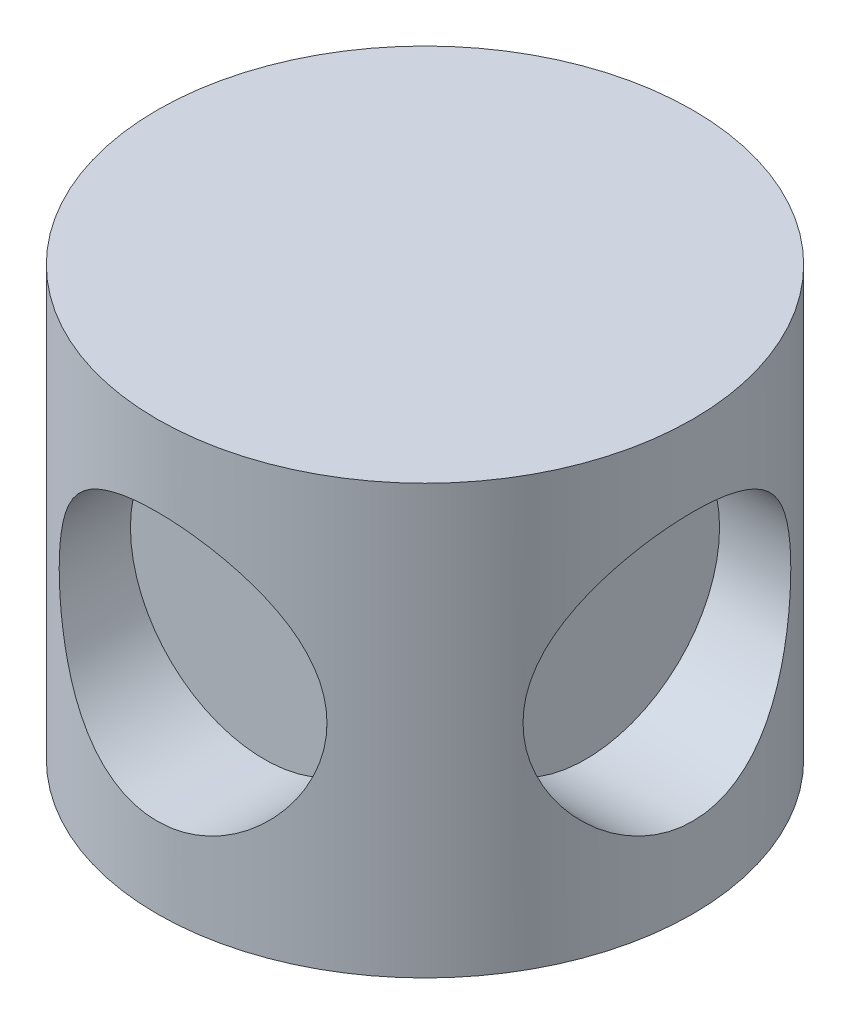
ISO-10303-21;
HEADER;
FILE_DESCRIPTION(('STEP AP214'),'2;1');
FILE_NAME('part.step','',(''),(''),'','','');
FILE_SCHEMA(('AUTOMOTIVE_DESIGN { 1 0 10303 214 1 1 1 1 }'));
ENDSEC;
DATA;
#1=APPLICATION_CONTEXT('core data for automotive mechanical design processes');
#2=APPLICATION_PROTOCOL_DEFINITION('international standard','automotive_design',2000,#1);
#3=PRODUCT_CONTEXT('',#1,'mechanical');
#4=PRODUCT('Part','Part','',(#3));
#5=PRODUCT_RELATED_PRODUCT_CATEGORY('part','',(#4));
#6=PRODUCT_DEFINITION_FORMATION('','',#4);
#7=PRODUCT_DEFINITION_CONTEXT('part definition',#1,'design');
#8=PRODUCT_DEFINITION('design','',#6,#7);
#9=PRODUCT_DEFINITION_SHAPE('','',#8);
#10=(LENGTH_UNIT() NAMED_UNIT(*) SI_UNIT(.MILLI.,.METRE.));
#11=(NAMED_UNIT(*) PLANE_ANGLE_UNIT() SI_UNIT($,.RADIAN.));
#12=(NAMED_UNIT(*) SI_UNIT($,.STERADIAN.) SOLID_ANGLE_UNIT());
#13=UNCERTAINTY_MEASURE_WITH_UNIT(LENGTH_MEASURE(1.E-05),#10,'distance_accuracy_value','');
#14=(GEOMETRIC_REPRESENTATION_CONTEXT(3) GLOBAL_UNCERTAINTY_ASSIGNED_CONTEXT((#13)) GLOBAL_UNIT_ASSIGNED_CONTEXT((#10,
#11,#12)) REPRESENTATION_CONTEXT('',''));
#15=CARTESIAN_POINT('',(0.,0.,0.));
#16=DIRECTION('',(0.,0.,1.));
#17=DIRECTION('',(1.,0.,0.));
#18=AXIS2_PLACEMENT_3D('',#15,#16,#17);
#19=CARTESIAN_POINT('',(0.,0.,0.));
#20=DIRECTION('',(0.,1.,0.));
#21=DIRECTION('',(1.,0.,0.));
#22=AXIS2_PLACEMENT_3D('',#19,#20,#21);
#23=PLANE('',#22);
#24=CARTESIAN_POINT('',(0.,0.,0.));
#25=DIRECTION('',(0.,1.,0.));
#26=DIRECTION('',(1.,0.,0.));
#27=AXIS2_PLACEMENT_3D('',#24,#25,#26);
#28=CIRCLE('',#27,25.);
#29=CARTESIAN_POINT('',(-25.,0.,0.));
#30=VERTEX_POINT('',#29);
#31=EDGE_CURVE('E11',#30,#30,#28,.T.);
#32=ORIENTED_EDGE('',*,*,#31,.F.);
#33=EDGE_LOOP('',(#32));
#34=FACE_BOUND('',#33,.T.);
#35=ADVANCED_FACE('F17',(#34),#23,.F.);
#36=CARTESIAN_POINT('',(0.,40.,0.));
#37=DIRECTION('',(0.,1.,0.));
#38=DIRECTION('',(1.,0.,0.));
#39=AXIS2_PLACEMENT_3D('',#36,#37,#38);
#40=PLANE('',#39);
#41=CARTESIAN_POINT('',(0.,40.,0.));
#42=DIRECTION('',(0.,1.,0.));
#43=DIRECTION('',(1.,0.,0.));
#44=AXIS2_PLACEMENT_3D('',#41,#42,#43);
#45=CIRCLE('',#44,25.);
#46=CARTESIAN_POINT('',(-25.,40.,0.));
#47=VERTEX_POINT('',#46);
#48=EDGE_CURVE('E154',#47,#47,#45,.T.);
#49=ORIENTED_EDGE('',*,*,#48,.T.);
#50=EDGE_LOOP('',(#49));
#51=FACE_BOUND('',#50,.T.);
#52=ADVANCED_FACE('F103',(#51),#40,.T.);
#53=CARTESIAN_POINT('',(0.,0.,0.));
#54=DIRECTION('',(0.,1.,0.));
#55=DIRECTION('',(1.,0.,0.));
#56=AXIS2_PLACEMENT_3D('',#53,#54,#55);
#57=CYLINDRICAL_SURFACE('',#56,25.);
#58=CARTESIAN_POINT('',(12.5,20.0000002980232,21.650635094611));
#59=CARTESIAN_POINT('',(12.500018135842,19.7941634114371,21.6506145983942));
#60=CARTESIAN_POINT('',(12.4950636390189,19.5883199571394,21.6534847200632));
#61=CARTESIAN_POINT('',(12.4751688470096,19.1780727046024,21.6649581039614));
#62=CARTESIAN_POINT('',(12.4602670826988,18.9736664149778,21.673539244102));
#63=CARTESIAN_POINT('',(12.4204522632843,18.56629227407,21.6963789581637));
#64=CARTESIAN_POINT('',(12.3955461716862,18.3633235219826,21.7106335829964));
#65=CARTESIAN_POINT('',(12.3357019327097,17.9588229972113,21.7446925260151));
#66=CARTESIAN_POINT('',(12.3007390122675,17.7572960481094,21.7645105456186));
#67=CARTESIAN_POINT('',(12.2207308989954,17.3556722325791,21.8095357825579));
#68=CARTESIAN_POINT('',(12.175630077806,17.1555897951343,21.8347726987142));
#69=CARTESIAN_POINT('',(12.0752737183179,16.7568453842748,21.890433593216));
#70=CARTESIAN_POINT('',(12.0199334846967,16.5582107892749,21.9209006687087));
#71=CARTESIAN_POINT('',(11.8990089329116,16.162346046928,21.9867774096253));
#72=CARTESIAN_POINT('',(11.8333134568001,15.9651587673665,22.0222402022005));
#73=CARTESIAN_POINT('',(11.6915458151399,15.5721821311492,22.0978345628983));
#74=CARTESIAN_POINT('',(11.6153388393775,15.376452969778,22.1380255814924));
#75=CARTESIAN_POINT('',(11.4567254146005,14.9965097880824,22.220512050571));
#76=CARTESIAN_POINT('',(11.3746387022303,14.8121344069793,22.2626805982932));
#77=CARTESIAN_POINT('',(11.2021835357267,14.4482726983621,22.3499532362464));
#78=CARTESIAN_POINT('',(11.1118245096841,14.2687811001867,22.395053968031));
#79=CARTESIAN_POINT('',(10.9227005390798,13.9146889601259,22.4879016597534));
#80=CARTESIAN_POINT('',(10.823925453225,13.7400946658733,22.5356517873329));
#81=CARTESIAN_POINT('',(10.6178610697291,13.3957820012593,22.6334725218002));
#82=CARTESIAN_POINT('',(10.5105427195975,13.2260831970154,22.6835507828393));
#83=CARTESIAN_POINT('',(10.2872742518179,12.8915488522234,22.7856784794626));
#84=CARTESIAN_POINT('',(10.1712772978273,12.7267475815469,22.8377377350944));
#85=CARTESIAN_POINT('',(9.93053395606293,12.4019927600524,22.9434503817893));
#86=CARTESIAN_POINT('',(9.80572451571197,12.2420890618391,22.9971132470547));
#87=CARTESIAN_POINT('',(9.54723522007463,11.927115486275,23.1056301794899));
#88=CARTESIAN_POINT('',(9.41347795917787,11.7721114383952,23.1604908124905));
#89=CARTESIAN_POINT('',(9.13698225598017,11.4669150091048,23.2709686618382));
#90=CARTESIAN_POINT('',(8.99415427837582,11.3168042105958,23.3265869559071));
#91=CARTESIAN_POINT('',(8.70336671995127,11.0254014957566,23.4366224538028));
#92=CARTESIAN_POINT('',(8.55550009430416,10.8840191448891,23.4910458110619));
#93=CARTESIAN_POINT('',(8.25414482572718,10.6095581430879,23.5986116470413));
#94=CARTESIAN_POINT('',(8.10071163773774,10.476421347153,23.651760940826));
#95=CARTESIAN_POINT('',(7.788211875518,10.2184351193943,23.7564884534943));
#96=CARTESIAN_POINT('',(7.62918601370587,10.0935395228658,23.8080743563464));
#97=CARTESIAN_POINT('',(7.30548900312479,9.85202464465862,23.9093803396799));
#98=CARTESIAN_POINT('',(7.14084412447755,9.73537305992055,23.9591072962009));
#99=CARTESIAN_POINT('',(6.80590828278562,9.51033179144994,24.0563912165931));
#100=CARTESIAN_POINT('',(6.63562983250495,9.40192535815982,24.1039524964493));
#101=CARTESIAN_POINT('',(6.28943569900762,9.19335709399748,24.1965928525015));
#102=CARTESIAN_POINT('',(6.11351991687652,9.09319540790044,24.2416718851055));
#103=CARTESIAN_POINT('',(5.75606657583401,8.90110476000775,24.3290283016791));
#104=CARTESIAN_POINT('',(5.57451784909935,8.80919377332377,24.3712995188089));
#105=CARTESIAN_POINT('',(5.20583725573573,8.63356652056724,24.4527103988141));
#106=CARTESIAN_POINT('',(5.01868507510609,8.54988644254406,24.4918361055924));
#107=CARTESIAN_POINT('',(4.63735331274341,8.39017231819768,24.5669136752085));
#108=CARTESIAN_POINT('',(4.44311222234686,8.31426065106212,24.6028138914018));
#109=CARTESIAN_POINT('',(4.05235599377836,8.17266578574837,24.6701708330144));
#110=CARTESIAN_POINT('',(3.8558810359589,8.1068907374202,24.701667186807));
#111=CARTESIAN_POINT('',(3.46077597121402,7.98553064809145,24.7601012053937));
#112=CARTESIAN_POINT('',(3.26217292135825,7.929873167763,24.7870711617542));
#113=CARTESIAN_POINT('',(2.86292310812157,7.82873365046777,24.8363426641476));
#114=CARTESIAN_POINT('',(2.66229215860376,7.78320063616839,24.8586675600341));
#115=CARTESIAN_POINT('',(2.25910419605803,7.70228639136937,24.8985415482035));
#116=CARTESIAN_POINT('',(2.05655403504844,7.66687746348814,24.9161036635364));
#117=CARTESIAN_POINT('',(1.64964740675696,7.60618782226979,24.9463478493774));
#118=CARTESIAN_POINT('',(1.4452915459359,7.58090383134457,24.9590314990625));
#119=CARTESIAN_POINT('',(1.03489558908469,7.54043969767827,24.9794173351121));
#120=CARTESIAN_POINT('',(0.828852836589912,7.52528114303294,24.9871088769922));
#121=CARTESIAN_POINT('',(0.415208668042124,7.50504111736364,24.9974118455455));
#122=CARTESIAN_POINT('',(0.207604425522768,7.500005806134,25.0000000008583));
#123=CARTESIAN_POINT('',(-0.207540230205063,7.49999479161566,24.9999999991419));
#124=CARTESIAN_POINT('',(-0.41508064330038,7.5050159781824,24.9974134424815));
#125=CARTESIAN_POINT('',(-0.828615505211449,7.52523326102926,24.9871163717049));
#126=CARTESIAN_POINT('',(-1.03461272569566,7.54038404587995,24.9794286770029));
#127=CARTESIAN_POINT('',(-1.44493608130325,7.5808345327097,24.9590518554121));
#128=CARTESIAN_POINT('',(-1.64926476192632,7.60611354436708,24.9463729257215));
#129=CARTESIAN_POINT('',(-2.05613551220862,7.66679602469471,24.9161381303442));
#130=CARTESIAN_POINT('',(-2.2586768071571,7.70220368072635,24.8985802476978));
#131=CARTESIAN_POINT('',(-2.66186545410424,7.78311798178526,24.8587133301977));
#132=CARTESIAN_POINT('',(-2.86250573131294,7.82865322485998,24.8363908485227));
#133=CARTESIAN_POINT('',(-3.26179259514121,7.92979965834677,24.7871214329862));
#134=CARTESIAN_POINT('',(-3.46042309783041,7.98546269560955,24.7601507430742));
#135=CARTESIAN_POINT('',(-3.85560094854158,8.10683722994473,24.7017112765958));
#136=CARTESIAN_POINT('',(-4.05212092963263,8.17262199207821,24.6702098227032));
#137=CARTESIAN_POINT('',(-4.44298610885484,8.314236463825,24.6028371738938));
#138=CARTESIAN_POINT('',(-4.63729080264923,8.39015875652303,24.5669259835413));
#139=CARTESIAN_POINT('',(-5.01862898148161,8.54985050979067,24.4918471482791));
#140=CARTESIAN_POINT('',(-5.20572673861749,8.63349207134536,24.452733482202));
#141=CARTESIAN_POINT('',(-5.57431407158153,8.80905462839678,24.3713458304015));
#142=CARTESIAN_POINT('',(-5.75582353902423,8.9009401771112,24.3290854964111));
#143=CARTESIAN_POINT('',(-6.1132151192559,9.09298905585722,24.2417485653896));
#144=CARTESIAN_POINT('',(-6.28910792096839,9.19313517967735,24.1966778676965));
#145=CARTESIAN_POINT('',(-6.63527231502299,9.40168225880889,24.1040508588554));
#146=CARTESIAN_POINT('',(-6.80554348444371,9.51008383316728,24.0564943613903));
#147=CARTESIAN_POINT('',(-7.14048080741628,9.73512515084107,23.9592156365365));
#148=CARTESIAN_POINT('',(-7.30513389243105,9.8517823876176,23.9094889014016));
#149=CARTESIAN_POINT('',(-7.62886321038431,10.0933182554235,23.8081779640366));
#150=CARTESIAN_POINT('',(-7.78791259610447,10.2182298978655,23.7565867305294));
#151=CARTESIAN_POINT('',(-8.10047445981612,10.476258561615,23.6518424550016));
#152=CARTESIAN_POINT('',(-8.25394563689608,10.6094224119869,23.5986816084748));
#153=CARTESIAN_POINT('',(-8.55539366779085,10.8839455363934,23.4910849446775));
#154=CARTESIAN_POINT('',(-8.7033144991793,11.0253635447688,23.4366422148941));
#155=CARTESIAN_POINT('',(-8.99411618909212,11.3167514766287,23.3266013685962));
#156=CARTESIAN_POINT('',(-9.13690843405231,11.4668076200957,23.2709973794367));
#157=CARTESIAN_POINT('',(-9.41334250630047,11.7719113977992,23.1605457039392));
#158=CARTESIAN_POINT('',(-9.54707328267182,11.9268779662688,23.1056969194408));
#159=CARTESIAN_POINT('',(-9.80552142170472,12.2417907897914,22.9971997375661));
#160=CARTESIAN_POINT('',(-9.93031552648848,12.4016717754551,22.9435448215065));
#161=CARTESIAN_POINT('',(-10.1710392717919,12.7263959994972,22.8378437149734));
#162=CARTESIAN_POINT('',(-10.2870312627163,12.891189938829,22.7857881520879));
#163=CARTESIAN_POINT('',(-10.5103008025351,13.2257243114027,22.6836629050383));
#164=CARTESIAN_POINT('',(-10.6176244517049,13.3954310138209,22.6335835556509));
#165=CARTESIAN_POINT('',(-10.8237103899792,13.7397741360811,22.535755163763));
#166=CARTESIAN_POINT('',(-10.922500976213,13.9143914989276,22.4879986681664));
#167=CARTESIAN_POINT('',(-11.1116661015941,14.2685448136796,22.3951326975843));
#168=CARTESIAN_POINT('',(-11.202050024577,14.4480749847091,22.3500202924929));
#169=CARTESIAN_POINT('',(-11.3745673777759,14.8120276119999,22.2627172012821));
#170=CARTESIAN_POINT('',(-11.456690640272,14.9964557525922,22.2205301352062));
#171=CARTESIAN_POINT('',(-11.6153380587585,15.3764207638044,22.1380259870959));
#172=CARTESIAN_POINT('',(-11.6915464909404,15.5721169984185,22.0978341948932));
#173=CARTESIAN_POINT('',(-11.8333153150914,15.965037906971,22.0222392188515));
#174=CARTESIAN_POINT('',(-11.8990102405927,16.16220249829,21.98677670094));
#175=CARTESIAN_POINT('',(-12.0199345363702,16.5580306638422,21.9209000921176));
#176=CARTESIAN_POINT('',(-12.0752747093752,16.7566515040236,21.8904330421928));
#177=CARTESIAN_POINT('',(-12.1756311745284,17.1553775480721,21.8347720917755));
#178=CARTESIAN_POINT('',(-12.2207317732679,17.3554554977769,21.8095352910553));
#179=CARTESIAN_POINT('',(-12.300739881469,17.7570793975181,21.7645100559694));
#180=CARTESIAN_POINT('',(-12.3357025968634,17.9586110283072,21.7446921479971));
#181=CARTESIAN_POINT('',(-12.3955468474839,18.3631300221098,21.7106331984125));
#182=CARTESIAN_POINT('',(-12.4204527120574,18.5661126481998,21.6963787007316));
#183=CARTESIAN_POINT('',(-12.4602675326428,18.9735236471884,21.6735389859864));
#184=CARTESIAN_POINT('',(-12.4751690722173,19.1779529793669,21.6649579748802));
#185=CARTESIAN_POINT('',(-12.4950638579671,19.588255514465,21.6534845929953));
#186=CARTESIAN_POINT('',(-12.5000181256449,19.7941312374401,21.650614601301));
#187=CARTESIAN_POINT('',(-12.5,20.0000002980232,21.6506350946109));
#188=B_SPLINE_CURVE_WITH_KNOTS('',3,(#58,#59,#60,#61,#62,#63,#64,#65,#66,#67,#68,#69,#70,#71,
#72,#73,#74,#75,#76,#77,#78,#79,#80,#81,#82,#83,#84,#85,#86,#87,#88,#89,#90,#91,#92,#93,#94,#95,
#96,#97,#98,#99,#100,#101,#102,#103,#104,#105,#106,#107,#108,#109,#110,#111,#112,#113,#114,#115,
#116,#117,#118,#119,#120,#121,#122,#123,#124,#125,#126,#127,#128,#129,#130,#131,#132,#133,#134,
#135,#136,#137,#138,#139,#140,#141,#142,#143,#144,#145,#146,#147,#148,#149,#150,#151,#152,#153,
#154,#155,#156,#157,#158,#159,#160,#161,#162,#163,#164,#165,#166,#167,#168,#169,#170,#171,#172,
#173,#174,#175,#176,#177,#178,#179,#180,#181,#182,#183,#184,#185,#186,#187),.UNSPECIFIED.,.F.,
.F.,(4,2,2,2,2,2,2,2,2,2,2,2,2,2,2,2,2,2,2,2,2,2,2,2,2,2,2,2,2,2,2,2,2,2,2,2,2,2,2,2,2,2,2,2,2,
2,2,2,2,2,2,2,2,2,2,2,2,2,2,2,2,2,2,2,4),(0.,0.617439472749179,1.23250105736169,
1.84713526855379,2.46329667244175,3.0829253722511,3.70792916870456,4.34016718802258,
4.98143561947662,5.59973973183031,6.21734772330359,6.83571074808509,7.45627464907138,
8.08046995986197,8.70970243030188,9.34534437374992,9.98872707269549,10.6235931643763,
11.2532998186243,11.8791116990426,12.5023171767621,13.1242208179436,13.7461353772299,
14.3693735361611,14.9952396438397,15.6298009922935,16.2582232877259,16.8819519320184,
17.5024651274796,18.1212641201534,18.7398626364246,19.3597758711453,19.982509422452,
20.6050504124581,21.2248251369257,21.8433401656917,22.4621112700197,23.0826523447802,
23.7064643987676,24.3350250079417,24.9697785882606,25.5954451092598,26.218539762181,
26.8403678285406,27.4622425695831,28.0854769555679,28.7113754042241,29.3412257855188,
29.9762919308139,30.6194773197834,31.2549774636934,31.8841245046094,32.508291282796,
33.1288837086128,33.7473320863755,34.3650816289378,34.983582462448,35.624762355581,
36.2569357588654,36.8819000511053,37.5015153725267,38.1176903266972,38.7323655802591,
39.3474960051134,39.9650321577721),.UNSPECIFIED.);
#189=CARTESIAN_POINT('',(12.5,20.0000002980232,21.650635094611));
#190=VERTEX_POINT('',#189);
#191=CARTESIAN_POINT('',(-12.5,20.0000002980232,21.650635094611));
#192=VERTEX_POINT('',#191);
#193=EDGE_CURVE('E166',#190,#192,#188,.T.);
#194=ORIENTED_EDGE('',*,*,#193,.T.);
#195=CARTESIAN_POINT('',(-12.5,20.0000002980232,21.6506350946109));
#196=CARTESIAN_POINT('',(-12.500018135842,20.2058371846003,21.6506145983942));
#197=CARTESIAN_POINT('',(-12.4950636390189,20.411680638889,21.6534847200632));
#198=CARTESIAN_POINT('',(-12.4751688470095,20.8219278914106,21.6649581039614));
#199=CARTESIAN_POINT('',(-12.4602670826987,21.0263341810288,21.6735392441021));
#200=CARTESIAN_POINT('',(-12.4204522632842,21.4337083219264,21.6963789581638));
#201=CARTESIAN_POINT('',(-12.395546171686,21.6366770740099,21.7106335829965));
#202=CARTESIAN_POINT('',(-12.3357019327095,22.041177598776,21.7446925260152));
#203=CARTESIAN_POINT('',(-12.3007390122673,22.2427045478767,21.7645105456188));
#204=CARTESIAN_POINT('',(-12.2207308989952,22.6443283634069,21.809535782558));
#205=CARTESIAN_POINT('',(-12.1756300778057,22.8444108008529,21.8347726987144));
#206=CARTESIAN_POINT('',(-12.0752737183177,23.2431552117176,21.8904335932162));
#207=CARTESIAN_POINT('',(-12.0199334846964,23.4417898067213,21.9209006687089));
#208=CARTESIAN_POINT('',(-11.8990089329112,23.8376545490785,21.9867774096255));
#209=CARTESIAN_POINT('',(-11.8333134567996,24.0348418286463,22.0222402022007));
#210=CARTESIAN_POINT('',(-11.6915458151397,24.4278184648792,22.0978345628984));
#211=CARTESIAN_POINT('',(-11.6153388393777,24.6235476262595,22.1380255814923));
#212=CARTESIAN_POINT('',(-11.4567254146086,25.003490807953,22.2205120505668));
#213=CARTESIAN_POINT('',(-11.3746387022469,25.1878661890452,22.2626805982846));
#214=CARTESIAN_POINT('',(-11.2021835357578,25.5517278976437,22.3499532362307));
#215=CARTESIAN_POINT('',(-11.111824509721,25.7312194958112,22.3950539680126));
#216=CARTESIAN_POINT('',(-10.9227005391263,26.0853116358593,22.4879016597308));
#217=CARTESIAN_POINT('',(-10.8239254532751,26.2599059301071,22.5356517873088));
#218=CARTESIAN_POINT('',(-10.6178610697842,26.6042185947149,22.6334725217744));
#219=CARTESIAN_POINT('',(-10.5105427196538,26.7739173989571,22.6835507828131));
#220=CARTESIAN_POINT('',(-10.2872742518745,27.1084517437491,22.785678479437));
#221=CARTESIAN_POINT('',(-10.1712772978827,27.2732530144271,22.8377377350698));
#222=CARTESIAN_POINT('',(-9.93053395611378,27.5980078359279,22.9434503817673));
#223=CARTESIAN_POINT('',(-9.80572451575925,27.7579115341459,22.9971132470346));
#224=CARTESIAN_POINT('',(-9.54723522011233,28.0728851097226,23.1056301794743));
#225=CARTESIAN_POINT('',(-9.41347795920943,28.2278891576101,23.1604908124778));
#226=CARTESIAN_POINT('',(-9.1369822559973,28.5330855869196,23.2709686618315));
#227=CARTESIAN_POINT('',(-8.99415427838455,28.6831963854398,23.3265869559038));
#228=CARTESIAN_POINT('',(-8.70336671996043,28.9745991002825,23.4366224537993));
#229=CARTESIAN_POINT('',(-8.55550009432302,29.1159814511431,23.491045811055));
#230=CARTESIAN_POINT('',(-8.25414482576265,29.3904424529324,23.5986116470288));
#231=CARTESIAN_POINT('',(-8.10071163778,29.523579248862,23.6517609408115));
#232=CARTESIAN_POINT('',(-7.78821187557137,29.7815654766125,23.7564884534768));
#233=CARTESIAN_POINT('',(-7.62918601376344,29.9064610731379,23.808074356328));
#234=CARTESIAN_POINT('',(-7.30548900318816,30.147975951341,23.9093803396605));
#235=CARTESIAN_POINT('',(-7.14084412454241,30.264627536078,23.9591072961816));
#236=CARTESIAN_POINT('',(-6.80590828285077,30.4896688045486,24.0563912165747));
#237=CARTESIAN_POINT('',(-6.63562983256878,30.5980752378397,24.1039524964318));
#238=CARTESIAN_POINT('',(-6.28943569906616,30.8066435020061,24.1965928524864));
#239=CARTESIAN_POINT('',(-6.11351991693096,30.9068051881061,24.2416718850918));
#240=CARTESIAN_POINT('',(-5.75606657587742,31.0988958360069,24.3290283016689));
#241=CARTESIAN_POINT('',(-5.57451784913574,31.1908068226958,24.3712995188006));
#242=CARTESIAN_POINT('',(-5.20583725575543,31.3664340754648,24.45271039881));
#243=CARTESIAN_POINT('',(-5.01868507511605,31.4501141534953,24.4918361055905));
#244=CARTESIAN_POINT('',(-4.63735331274703,31.6098282778502,24.5669136752077));
#245=CARTESIAN_POINT('',(-4.4431122223542,31.6857399449876,24.6028138914004));
#246=CARTESIAN_POINT('',(-4.05235599379198,31.8273348103042,24.6701708330122));
#247=CARTESIAN_POINT('',(-3.85588103597508,31.8931098586333,24.7016671868044));
#248=CARTESIAN_POINT('',(-3.46077597123435,32.0144699479638,24.7601012053909));
#249=CARTESIAN_POINT('',(-3.26217292138016,32.0701274282929,24.7870711617513));
#250=CARTESIAN_POINT('',(-2.86292310814559,32.171266945589,24.8363426641448));
#251=CARTESIAN_POINT('',(-2.66229215862829,32.2167999598886,24.8586675600315));
#252=CARTESIAN_POINT('',(-2.25910419608259,32.2977142046876,24.8985415482012));
#253=CARTESIAN_POINT('',(-2.05655403507248,32.3331231325686,24.9161036635345));
#254=CARTESIAN_POINT('',(-1.64964740677892,32.393812773786,24.946347849376));
#255=CARTESIAN_POINT('',(-1.44529154595629,32.4190967647106,24.9590314990613));
#256=CARTESIAN_POINT('',(-1.03489558910088,32.4595608983752,24.9794173351115));
#257=CARTESIAN_POINT('',(-0.828852836603487,32.4747194530194,24.9871088769917));
#258=CARTESIAN_POINT('',(-0.415208668049415,32.494959478686,24.9974118455454));
#259=CARTESIAN_POINT('',(-0.207604425526396,32.4999947899141,25.0000000008583));
#260=CARTESIAN_POINT('',(0.20754023020703,32.5000058044291,24.9999999991419));
#261=CARTESIAN_POINT('',(0.415080643304277,32.4949846178608,24.9974134424814));
#262=CARTESIAN_POINT('',(0.828615505218643,32.4747673350113,24.9871163717047));
#263=CARTESIAN_POINT('',(1.03461272570422,32.4596165501596,24.9794286770025));
#264=CARTESIAN_POINT('',(1.44493608131399,32.4191660633281,24.9590518554115));
#265=CARTESIAN_POINT('',(1.64926476193787,32.3938870516701,24.9463729257208));
#266=CARTESIAN_POINT('',(2.05613551222125,32.3332045713416,24.9161381303432));
#267=CARTESIAN_POINT('',(2.25867680717,32.2977969153098,24.8985802476966));
#268=CARTESIAN_POINT('',(2.66186545411712,32.2168826142508,24.8587133301963));
#269=CARTESIAN_POINT('',(2.86250573132552,32.1713473711763,24.8363908485212));
#270=CARTESIAN_POINT('',(3.26179259515267,32.0702009376904,24.7871214329847));
#271=CARTESIAN_POINT('',(3.46042309784106,32.0145379004283,24.7601507430727));
#272=CARTESIAN_POINT('',(3.85560094855002,31.8931633660949,24.7017112765945));
#273=CARTESIAN_POINT('',(4.05212092963967,31.8273786039625,24.670209822702));
#274=CARTESIAN_POINT('',(4.4429861088586,31.6857641322184,24.6028371738931));
#275=CARTESIAN_POINT('',(4.63729080265113,31.6098418395219,24.5669259835409));
#276=CARTESIAN_POINT('',(5.01862898147737,31.4501500862583,24.4918471482799));
#277=CARTESIAN_POINT('',(5.20572673860904,31.3665085247061,24.4527334822038));
#278=CARTESIAN_POINT('',(5.57431407156595,31.190945967659,24.371345830405));
#279=CARTESIAN_POINT('',(5.75582353900568,31.0990604189464,24.3290854964154));
#280=CARTESIAN_POINT('',(6.11321511923265,30.9070115402032,24.2417485653955));
#281=CARTESIAN_POINT('',(6.28910792094337,30.8068654163841,24.1966778677029));
#282=CARTESIAN_POINT('',(6.6352723149957,30.598318337254,24.1040508588629));
#283=CARTESIAN_POINT('',(6.80554348441587,30.4899167628959,24.0564943613981));
#284=CARTESIAN_POINT('',(7.14048080738857,30.2648754452221,23.9592156365447));
#285=CARTESIAN_POINT('',(7.30513389240397,30.1482182084452,23.9094889014099));
#286=CARTESIAN_POINT('',(7.62886321035971,29.9066823406379,23.8081779640445));
#287=CARTESIAN_POINT('',(7.78791259608167,29.7817706981948,23.7565867305368));
#288=CARTESIAN_POINT('',(8.10047445979808,29.5237420344424,23.6518424550078));
#289=CARTESIAN_POINT('',(8.25394563688095,29.3905781840688,23.5986816084801));
#290=CARTESIAN_POINT('',(8.55539366778277,29.1160550596579,23.4910849446804));
#291=CARTESIAN_POINT('',(8.70331449917532,28.9746370512801,23.4366422148956));
#292=CARTESIAN_POINT('',(8.99411618909756,28.6832491194141,23.3266013685941));
#293=CARTESIAN_POINT('',(9.13690843406301,28.5331929759435,23.2709973794326));
#294=CARTESIAN_POINT('',(9.41334250632007,28.2280891982337,23.1605457039313));
#295=CARTESIAN_POINT('',(9.54707328269511,28.0731226297615,23.1056969194312));
#296=CARTESIAN_POINT('',(9.80552142173381,27.7582098062345,22.9971997375537));
#297=CARTESIAN_POINT('',(9.93031552651977,27.5983288205693,22.9435448214929));
#298=CARTESIAN_POINT('',(10.171039271826,27.2736045965251,22.8378437149582));
#299=CARTESIAN_POINT('',(10.2870312627511,27.1088106571928,22.7857881520722));
#300=CARTESIAN_POINT('',(10.5103008025697,26.7742762846191,22.6836629050223));
#301=CARTESIAN_POINT('',(10.6176244517388,26.6045695822015,22.633583555635));
#302=CARTESIAN_POINT('',(10.82371039001,26.2602264599433,22.5357551637481));
#303=CARTESIAN_POINT('',(10.9225009762416,26.0856090970984,22.4879986681525));
#304=CARTESIAN_POINT('',(11.1116661016169,25.7314557823507,22.395132697573));
#305=CARTESIAN_POINT('',(11.2020500245962,25.5519256113239,22.3500202924832));
#306=CARTESIAN_POINT('',(11.3745673777863,25.1879729840393,22.2627172012767));
#307=CARTESIAN_POINT('',(11.4566906402771,25.0035448434506,22.2205301352035));
#308=CARTESIAN_POINT('',(11.6153380587586,24.6235798322334,22.1380259870959));
#309=CARTESIAN_POINT('',(11.6915464909403,24.4278835976105,22.0978341948933));
#310=CARTESIAN_POINT('',(11.8333153150911,24.0349626890432,22.0222392188517));
#311=CARTESIAN_POINT('',(11.8990102405924,23.8377980977181,21.9867767009401));
#312=CARTESIAN_POINT('',(12.01993453637,23.4419699321561,21.9209000921177));
#313=CARTESIAN_POINT('',(12.075274709375,23.2433490919711,21.8904330421929));
#314=CARTESIAN_POINT('',(12.1756311745282,22.8446230479177,21.8347720917757));
#315=CARTESIAN_POINT('',(12.2207317732677,22.6445450982117,21.8095352910554));
#316=CARTESIAN_POINT('',(12.3007398814687,22.2429211984704,21.7645100559695));
#317=CARTESIAN_POINT('',(12.3357025968632,22.0413895676826,21.7446921479972));
#318=CARTESIAN_POINT('',(12.3955468474837,21.636870573885,21.7106331984126));
#319=CARTESIAN_POINT('',(12.4204527120573,21.4338879477986,21.6963787007317));
#320=CARTESIAN_POINT('',(12.4602675326426,21.0264769488199,21.6735389859865));
#321=CARTESIAN_POINT('',(12.4751690722172,20.8220476166475,21.6649579748802));
#322=CARTESIAN_POINT('',(12.4950638579671,20.4117450815641,21.6534845929953));
#323=CARTESIAN_POINT('',(12.5000181256449,20.2058693585977,21.650614601301));
#324=CARTESIAN_POINT('',(12.5,20.0000002980232,21.650635094611));
#325=B_SPLINE_CURVE_WITH_KNOTS('',3,(#195,#196,#197,#198,#199,#200,#201,#202,#203,#204,#205,
#206,#207,#208,#209,#210,#211,#212,#213,#214,#215,#216,#217,#218,#219,#220,#221,#222,#223,#224,
#225,#226,#227,#228,#229,#230,#231,#232,#233,#234,#235,#236,#237,#238,#239,#240,#241,#242,#243,
#244,#245,#246,#247,#248,#249,#250,#251,#252,#253,#254,#255,#256,#257,#258,#259,#260,#261,#262,
#263,#264,#265,#266,#267,#268,#269,#270,#271,#272,#273,#274,#275,#276,#277,#278,#279,#280,#281,
#282,#283,#284,#285,#286,#287,#288,#289,#290,#291,#292,#293,#294,#295,#296,#297,#298,#299,#300,
#301,#302,#303,#304,#305,#306,#307,#308,#309,#310,#311,#312,#313,#314,#315,#316,#317,#318,#319,
#320,#321,#322,#323,#324),.UNSPECIFIED.,.F.,.F.,(4,2,2,2,2,2,2,2,2,2,2,2,2,2,2,2,2,2,2,2,2,2,2,
2,2,2,2,2,2,2,2,2,2,2,2,2,2,2,2,2,2,2,2,2,2,2,2,2,2,2,2,2,2,2,2,2,2,2,2,2,2,2,2,2,4),(0.,
0.617439472722228,1.23250105731556,1.84713526849623,2.46329667238043,3.08292537219353,
3.70792916865803,4.34016718799409,4.98143561947285,5.59973973178452,6.21734772322748,
6.83571074799065,7.45627464897078,8.08046995976755,8.70970243022596,9.34534437370479,
9.98872707269336,10.6235931643374,11.2532998185589,11.8791116989614,12.5023171766754,
13.1242208178623,13.7461353771644,14.3693735361217,14.9952396438366,15.6298009922818,
16.2582232877077,16.8819519319962,17.502465127456,18.1212641201312,18.7398626364069,
19.3597758711352,19.9825094224527,20.6050504124648,21.2248251369367,21.8433401657054,
22.4621112700343,23.0826523447939,23.7064643987785,24.3350250079475,24.9697785882594,
25.5954451092438,26.2185397621543,26.8403678285074,27.4622425695479,28.0854769555348,
28.7113754041974,29.3412257855026,29.9762919308124,30.6194773198018,31.2549774637257,
31.88412450465,32.5082912828394,33.1288837086535,33.7473320864083,34.3650816289578,
34.9835824624505,35.6247623556072,36.2569357589088,36.8819000511593,37.5015153725842,
38.1176903267512,38.732365580302,39.347496005138,39.9650321577709),.UNSPECIFIED.);
#326=EDGE_CURVE('E161',#192,#190,#325,.T.);
#327=ORIENTED_EDGE('',*,*,#326,.T.);
#328=EDGE_LOOP('',(#194,#327));
#329=FACE_BOUND('',#328,.T.);
#330=CARTESIAN_POINT('',(21.650635094611,20.,-12.5));
#331=CARTESIAN_POINT('',(21.6506145983942,19.7941631134142,-12.500018135842));
#332=CARTESIAN_POINT('',(21.6534847200632,19.5883196591167,-12.4950636390189));
#333=CARTESIAN_POINT('',(21.6649581039614,19.1780724065802,-12.4751688470095));
#334=CARTESIAN_POINT('',(21.6735392441021,18.9736661169557,-12.4602670826988));
#335=CARTESIAN_POINT('',(21.6963789581637,18.5662919760482,-12.4204522632843));
#336=CARTESIAN_POINT('',(21.7106335829964,18.3633232239609,-12.3955461716861));
#337=CARTESIAN_POINT('',(21.7446925260151,17.9588226991898,-12.3357019327097));
#338=CARTESIAN_POINT('',(21.7645105456187,17.7572957500879,-12.3007390122674));
#339=CARTESIAN_POINT('',(21.8095357825579,17.3556719345576,-12.2207308989954));
#340=CARTESIAN_POINT('',(21.8347726987142,17.1555894971128,-12.1756300778059));
#341=CARTESIAN_POINT('',(21.8904335932161,16.7568450862531,-12.0752737183179));
#342=CARTESIAN_POINT('',(21.9209006687087,16.5582104912532,-12.0199334846967));
#343=CARTESIAN_POINT('',(21.9867774096253,16.1623457489059,-11.8990089329115));
#344=CARTESIAN_POINT('',(22.0222402022005,15.9651584693442,-11.8333134568));
#345=CARTESIAN_POINT('',(22.0978345628983,15.5721818331264,-11.6915458151399));
#346=CARTESIAN_POINT('',(22.1380255814923,15.376452671755,-11.6153388393776));
#347=CARTESIAN_POINT('',(22.2205120505695,14.9965094900662,-11.4567254146034));
#348=CARTESIAN_POINT('',(22.2626805982901,14.8121341089702,-11.3746387022363));
#349=CARTESIAN_POINT('',(22.3499532362407,14.4482724003651,-11.202183535738));
#350=CARTESIAN_POINT('',(22.3950539680242,14.2687808021947,-11.1118245096976));
#351=CARTESIAN_POINT('',(22.4879016597452,13.9146886621421,-10.9227005390969));
#352=CARTESIAN_POINT('',(22.5356517873241,13.7400943678925,-10.8239254532434));
#353=CARTESIAN_POINT('',(22.6334725217907,13.3957817032825,-10.6178610697494));
#354=CARTESIAN_POINT('',(22.6835507828297,13.2260828990397,-10.5105427196182));
#355=CARTESIAN_POINT('',(22.7856784794532,12.8915485542476,-10.2872742518387));
#356=CARTESIAN_POINT('',(22.8377377350854,12.7267472835701,-10.1712772978477));
#357=CARTESIAN_POINT('',(22.9434503817812,12.4019924620718,-9.93053395608158));
#358=CARTESIAN_POINT('',(22.9971132470474,12.2420887638558,-9.80572451572916));
#359=CARTESIAN_POINT('',(23.1056301794842,11.9271151882828,-9.5472352200886));
#360=CARTESIAN_POINT('',(23.1604908124858,11.7721111403969,-9.41347795919002));
#361=CARTESIAN_POINT('',(23.2709686618359,11.4669147110975,-9.13698225598574));
#362=CARTESIAN_POINT('',(23.3265869559064,11.3168039125858,-8.99415427837656));
#363=CARTESIAN_POINT('',(23.4366224537995,11.0254011977312,-8.70336671996134));
#364=CARTESIAN_POINT('',(23.4910458110545,10.8840188468509,-8.55550009432882));
#365=CARTESIAN_POINT('',(23.5986116470329,10.6095578451012,-8.25414482574713));
#366=CARTESIAN_POINT('',(23.6517609408207,10.4764210492302,-8.10071163773856));
#367=CARTESIAN_POINT('',(23.7564884534735,10.2184348213098,-7.78821187559507));
#368=CARTESIAN_POINT('',(23.8080743563073,10.0935392245576,-7.62918601387751));
#369=CARTESIAN_POINT('',(23.9093803396881,9.8520243469678,-7.30548900305235));
#370=CARTESIAN_POINT('',(23.9591072962745,9.73537276306643,-7.14084412406817));
#371=CARTESIAN_POINT('',(24.056391216489,9.51033149231213,-6.80590828330006));
#372=CARTESIAN_POINT('',(24.1039524961028,9.40192505590999,-6.63562983427672));
#373=CARTESIAN_POINT('',(24.1965928528214,9.19335680024983,-6.28943569733562));
#374=CARTESIAN_POINT('',(24.2416718863341,9.09319512576734,-6.11351991050321));
#375=CARTESIAN_POINT('',(24.3290283004283,8.90110444609958,-5.75606658230083));
#376=CARTESIAN_POINT('',(24.3712995141608,8.80919341590895,-5.57451787315489));
#377=CARTESIAN_POINT('',(24.4527104034716,8.63356628220843,-5.20583723162478));
#378=CARTESIAN_POINT('',(24.4918361230207,8.54988636761771,-5.01868498488813));
#379=CARTESIAN_POINT('',(24.5669165532036,8.39016563394629,-4.63733869663629));
#380=CARTESIAN_POINT('',(24.6028193255937,8.31424787212262,-4.44308280458731));
#381=CARTESIAN_POINT('',(24.6701799385727,8.17264256336941,-4.05230108279662));
#382=CARTESIAN_POINT('',(24.7016775009823,8.10686296366555,-3.85581552333585));
#383=CARTESIAN_POINT('',(24.7601128062242,7.98549579627101,-3.46069333429865));
#384=CARTESIAN_POINT('',(24.787082938099,7.9298355737234,-3.26208384284831));
#385=CARTESIAN_POINT('',(24.83635395324,7.82869254151298,-2.86282531629367));
#386=CARTESIAN_POINT('',(24.8586782873695,7.78315853296782,-2.66219216383683));
#387=CARTESIAN_POINT('',(24.8985506200678,7.70224427062992,-2.25900400971039));
#388=CARTESIAN_POINT('',(24.9161117452236,7.6668360968142,-2.05645591500807));
#389=CARTESIAN_POINT('',(24.9463537302127,7.60615001017621,-1.64955767326785));
#390=CARTESIAN_POINT('',(24.9590362740947,7.58086860154774,-1.44520817302257));
#391=CARTESIAN_POINT('',(24.9794199968677,7.54041137011469,-1.03482921735591));
#392=CARTESIAN_POINT('',(24.9871106361959,7.52525692670825,-0.828797131498577));
#393=CARTESIAN_POINT('',(24.9974122216692,7.50502798526146,-0.415178572752848));
#394=CARTESIAN_POINT('',(25.0000000001914,7.49999945796345,-0.20758928638191));
#395=CARTESIAN_POINT('',(24.9999999998087,7.50000054194798,0.207555366981876));
#396=CARTESIAN_POINT('',(24.9974130665036,7.50502850989834,0.41511073397472));
#397=CARTESIAN_POINT('',(24.987114613161,7.52525687311885,0.828671201791566));
#398=CARTESIAN_POINT('',(24.9794260162164,7.54041176763557,1.03467908725768));
#399=CARTESIAN_POINT('',(24.9590470820172,7.58086915424565,1.44501944144568));
#400=CARTESIAN_POINT('',(24.9463670468378,7.6061507472224,1.64935448169492));
#401=CARTESIAN_POINT('',(24.9161300511594,7.66683678089785,2.05623361728515));
#402=CARTESIAN_POINT('',(24.8985711785411,7.70224519066921,2.25877697824951));
#403=CARTESIAN_POINT('',(24.8587026058211,7.78315947419377,2.66196543367789));
#404=CARTESIAN_POINT('',(24.8363795624176,7.82869372335535,2.86260350829797));
#405=CARTESIAN_POINT('',(24.7871096594853,7.92983664315835,3.26188166015739));
#406=CARTESIAN_POINT('',(24.7601391449143,7.98549693916978,3.46050572223113));
#407=CARTESIAN_POINT('',(24.7017009645511,8.10686439793041,3.85566645124434));
#408=CARTESIAN_POINT('',(24.6702007189229,8.17264461031539,4.05217583227746));
#409=CARTESIAN_POINT('',(24.6028317406173,8.31424864231249,4.44301552215333));
#410=CARTESIAN_POINT('',(24.5669231059906,8.39016484261257,4.63730541650051));
#411=CARTESIAN_POINT('',(24.4918471308738,8.54984998894379,5.01862907157969));
#412=CARTESIAN_POINT('',(24.4527334775477,8.63349171373375,5.20572676271032));
#413=CARTESIAN_POINT('',(24.3713458350374,8.80905438971326,5.5743140475841));
#414=CARTESIAN_POINT('',(24.3290854976526,8.90093989497089,5.75582353259794));
#415=CARTESIAN_POINT('',(24.2417485641522,9.09298874197688,6.11321512566268));
#416=CARTESIAN_POINT('',(24.1966778673656,9.19313487740181,6.28910792268236));
#417=CARTESIAN_POINT('',(24.1040508591885,9.40168196503018,6.63527231330074));
#418=CARTESIAN_POINT('',(24.0564943614805,9.51008353627951,6.80554348397848));
#419=CARTESIAN_POINT('',(23.9592156364485,9.73512485167124,7.14048080787382));
#420=CARTESIAN_POINT('',(23.9094889013789,9.8517820892834,7.30513389255084));
#421=CARTESIAN_POINT('',(23.8081779640619,10.0933179577045,7.6288632102559));
#422=CARTESIAN_POINT('',(23.756586730537,10.2182295999215,7.78791259606742));
#423=CARTESIAN_POINT('',(23.6518424549961,10.4762582635056,8.10047445984701));
#424=CARTESIAN_POINT('',(23.5986816084739,10.6094221139388,8.25394563690278));
#425=CARTESIAN_POINT('',(23.4910849446797,10.8839452383915,8.55539366778046));
#426=CARTESIAN_POINT('',(23.4366422148948,11.025363246751,8.70331449917626));
#427=CARTESIAN_POINT('',(23.326601368596,11.3167511785985,8.99411618909379));
#428=CARTESIAN_POINT('',(23.2709973794373,11.4668073220692,9.13690843405132));
#429=CARTESIAN_POINT('',(23.1605457039406,11.7719110997744,9.41334250629674));
#430=CARTESIAN_POINT('',(23.1056969194423,11.9268776682422,9.54707328266797));
#431=CARTESIAN_POINT('',(22.997199737568,12.2417904917631,9.80552142170029));
#432=CARTESIAN_POINT('',(22.9435448215086,12.4016714774267,9.93031552648359));
#433=CARTESIAN_POINT('',(22.8378437149758,12.7263957014685,10.1710392717865));
#434=CARTESIAN_POINT('',(22.7857881520904,12.8911896408001,10.2870312627108));
#435=CARTESIAN_POINT('',(22.6836629050408,13.2257240133738,10.5103008025296));
#436=CARTESIAN_POINT('',(22.6335835556534,13.3954307157921,10.6176244516995));
#437=CARTESIAN_POINT('',(22.5357551637653,13.7397738380528,10.8237103899743));
#438=CARTESIAN_POINT('',(22.4879986681686,13.9143912008997,10.9225009762085));
#439=CARTESIAN_POINT('',(22.3951326975861,14.2685445156526,11.1116661015905));
#440=CARTESIAN_POINT('',(22.3500202924944,14.4480746866827,11.202050024574));
#441=CARTESIAN_POINT('',(22.2627172012829,14.812027313975,11.3745673777743));
#442=CARTESIAN_POINT('',(22.2205301352066,14.9964554545681,11.4566906402712));
#443=CARTESIAN_POINT('',(22.1380259870959,15.3764204657801,11.6153380587585));
#444=CARTESIAN_POINT('',(22.0978341948932,15.572116700393,11.6915464909405));
#445=CARTESIAN_POINT('',(22.0222392188515,15.9650376089436,11.8333153150915));
#446=CARTESIAN_POINT('',(21.9867767009399,16.1622022002619,11.8990102405927));
#447=CARTESIAN_POINT('',(21.9209000921175,16.5580303658128,12.0199345363703));
#448=CARTESIAN_POINT('',(21.8904330421927,16.7566512059937,12.0752747093752));
#449=CARTESIAN_POINT('',(21.8347720917755,17.1553772500415,12.1756311745285));
#450=CARTESIAN_POINT('',(21.8095352910553,17.3554551997461,12.2207317732679));
#451=CARTESIAN_POINT('',(21.7645100559694,17.7570790994874,12.3007398814689));
#452=CARTESIAN_POINT('',(21.7446921479971,17.9586107302766,12.3357025968633));
#453=CARTESIAN_POINT('',(21.7106331984125,18.3631297240799,12.3955468474838));
#454=CARTESIAN_POINT('',(21.6963787007316,18.5661123501704,12.4204527120574));
#455=CARTESIAN_POINT('',(21.6735389859864,18.9735233491603,12.4602675326427));
#456=CARTESIAN_POINT('',(21.6649579748802,19.1779526813396,12.4751690722172));
#457=CARTESIAN_POINT('',(21.6534845929953,19.5882552164396,12.4950638579671));
#458=CARTESIAN_POINT('',(21.650614601301,19.7941309394158,12.5000181256448));
#459=CARTESIAN_POINT('',(21.650635094611,20.,12.5));
#460=B_SPLINE_CURVE_WITH_KNOTS('',3,(#330,#331,#332,#333,#334,#335,#336,#337,#338,#339,#340,
#341,#342,#343,#344,#345,#346,#347,#348,#349,#350,#351,#352,#353,#354,#355,#356,#357,#358,#359,
#360,#361,#362,#363,#364,#365,#366,#367,#368,#369,#370,#371,#372,#373,#374,#375,#376,#377,#378,
#379,#380,#381,#382,#383,#384,#385,#386,#387,#388,#389,#390,#391,#392,#393,#394,#395,#396,#397,
#398,#399,#400,#401,#402,#403,#404,#405,#406,#407,#408,#409,#410,#411,#412,#413,#414,#415,#416,
#417,#418,#419,#420,#421,#422,#423,#424,#425,#426,#427,#428,#429,#430,#431,#432,#433,#434,#435,
#436,#437,#438,#439,#440,#441,#442,#443,#444,#445,#446,#447,#448,#449,#450,#451,#452,#453,#454,
#455,#456,#457,#458,#459),.UNSPECIFIED.,.F.,.F.,(4,2,2,2,2,2,2,2,2,2,2,2,2,2,2,2,2,2,2,2,2,2,2,
2,2,2,2,2,2,2,2,2,2,2,2,2,2,2,2,2,2,2,2,2,2,2,2,2,2,2,2,2,2,2,2,2,2,2,2,2,2,2,2,2,4),(0.,
0.617439472748402,1.23250105736036,1.84713526855214,2.46329667244,3.08292537224945,
3.70792916870324,4.34016718802179,4.98143561947655,5.59973973180669,6.21734772326318,
6.83571074803464,7.45627464901761,8.08046995981149,8.70970243026118,9.34534437372529,
9.98872707269307,10.6235931643477,11.2532998185768,11.8791116989837,12.5023171766992,
13.1242208178846,13.7461353771826,14.3693735361332,14.995239643839,15.6298496057501,
16.2583065472231,16.8820558834408,17.5025759274718,18.1213681373204,18.7399465527643,
19.3598267800183,19.9825149195195,20.6051013138464,21.2249090404206,21.8434441667313,
22.4622220527548,23.0827562801168,23.7065476458145,24.3350736151708,24.9697785908767,
25.5954451118732,26.2185397647925,26.8403678311508,27.462242572193,28.0854769581782,
28.7113754068356,29.3412257881322,29.9762919334302,30.619477322396,31.2549774663033,
31.8841245072177,32.5082912854038,33.1288837112211,33.7473320889854,34.3650816315503,
34.9835824650639,35.6247623581939,36.256935761476,36.8819000537145,37.5015153751354,
38.1176903293065,38.7323655828697,39.3474960077265,39.9650321603885),.UNSPECIFIED.);
#461=CARTESIAN_POINT('',(21.650635094611,20.,-12.5));
#462=VERTEX_POINT('',#461);
#463=CARTESIAN_POINT('',(21.650635094611,20.,12.5));
#464=VERTEX_POINT('',#463);
#465=EDGE_CURVE('E74',#462,#464,#460,.T.);
#466=ORIENTED_EDGE('',*,*,#465,.T.);
#467=CARTESIAN_POINT('',(21.650635094611,20.,12.5));
#468=CARTESIAN_POINT('',(21.6506145983942,20.2058368865771,12.5000181358419));
#469=CARTESIAN_POINT('',(21.6534847200632,20.4116803408658,12.4950636390188));
#470=CARTESIAN_POINT('',(21.6649581039615,20.8219275933874,12.4751688470094));
#471=CARTESIAN_POINT('',(21.6735392441021,21.0263338830056,12.4602670826986));
#472=CARTESIAN_POINT('',(21.6963789581638,21.4337080239032,12.4204522632841));
#473=CARTESIAN_POINT('',(21.7106335829966,21.6366767759867,12.3955461716859));
#474=CARTESIAN_POINT('',(21.7446925260153,22.0411773007528,12.3357019327094));
#475=CARTESIAN_POINT('',(21.7645105456188,22.2427042498534,12.3007390122672));
#476=CARTESIAN_POINT('',(21.809535782558,22.6443280653837,12.2207308989951));
#477=CARTESIAN_POINT('',(21.8347726987144,22.8444105028297,12.1756300778056));
#478=CARTESIAN_POINT('',(21.8904335932162,23.2431549136944,12.0752737183176));
#479=CARTESIAN_POINT('',(21.9209006687089,23.4417895086981,12.0199334846964));
#480=CARTESIAN_POINT('',(21.9867774096255,23.8376542510552,11.8990089329112));
#481=CARTESIAN_POINT('',(22.0222402022008,24.0348415306231,11.8333134567995));
#482=CARTESIAN_POINT('',(22.0978345628985,24.4278181668559,11.6915458151396));
#483=CARTESIAN_POINT('',(22.1380255814923,24.6235473282362,11.6153388393776));
#484=CARTESIAN_POINT('',(22.2205120505668,25.0034905099297,11.4567254146086));
#485=CARTESIAN_POINT('',(22.2626805982847,25.1878658910219,11.3746387022469));
#486=CARTESIAN_POINT('',(22.3499532362308,25.5517275996204,11.2021835357578));
#487=CARTESIAN_POINT('',(22.3950539680126,25.7312191977879,11.1118245097209));
#488=CARTESIAN_POINT('',(22.4879016597309,26.085311337836,10.9227005391262));
#489=CARTESIAN_POINT('',(22.5356517873088,26.2599056320839,10.823925453275));
#490=CARTESIAN_POINT('',(22.6334725217744,26.6042182966917,10.6178610697842));
#491=CARTESIAN_POINT('',(22.6835507828132,26.7739171009339,10.5105427196538));
#492=CARTESIAN_POINT('',(22.785678479437,27.108451445726,10.2872742518745));
#493=CARTESIAN_POINT('',(22.8377377350698,27.2732527164041,10.1712772978827));
#494=CARTESIAN_POINT('',(22.9434503817673,27.5980075379046,9.93053395611374));
#495=CARTESIAN_POINT('',(22.9971132470346,27.7579112361223,9.80572451575907));
#496=CARTESIAN_POINT('',(23.1056301794743,28.0728848116998,9.54723522011252));
#497=CARTESIAN_POINT('',(23.1604908124776,28.2278888595886,9.41347795921012));
#498=CARTESIAN_POINT('',(23.2709686618316,28.5330852888947,9.13698225599668));
#499=CARTESIAN_POINT('',(23.3265869559043,28.6831960874104,8.99415427838207));
#500=CARTESIAN_POINT('',(23.4366224537998,28.9745988022681,8.70336671996042));
#501=CARTESIAN_POINT('',(23.4910458110551,29.1159811531477,8.55550009432709));
#502=CARTESIAN_POINT('',(23.598611647034,29.3904421548963,8.254144825744));
#503=CARTESIAN_POINT('',(23.651760940822,29.5235789507669,8.10071163773484));
#504=CARTESIAN_POINT('',(23.7564884534751,29.7815651786865,7.7882118755904));
#505=CARTESIAN_POINT('',(23.8080743563089,29.9064607754384,7.62918601387248));
#506=CARTESIAN_POINT('',(23.9093803396897,30.1479756530278,7.30548900304683));
#507=CARTESIAN_POINT('',(23.9591072962761,30.2646272369291,7.14084412406253));
#508=CARTESIAN_POINT('',(24.0563912164905,30.4896685076834,6.80590828329441));
#509=CARTESIAN_POINT('',(24.1039524961043,30.5980749440856,6.63562983427118));
#510=CARTESIAN_POINT('',(24.1965928528227,30.8066431997462,6.28943569733054));
#511=CARTESIAN_POINT('',(24.2416718863353,30.9068048742289,6.11351991049849));
#512=CARTESIAN_POINT('',(24.3290283004292,31.0988955538974,5.75606658229707));
#513=CARTESIAN_POINT('',(24.3712995141615,31.1908065840885,5.57451787315172));
#514=CARTESIAN_POINT('',(24.452710403472,31.3664337177902,5.20583723162309));
#515=CARTESIAN_POINT('',(24.4918361230209,31.4501136323816,5.01868498488733));
#516=CARTESIAN_POINT('',(24.5669165532031,31.6098343660538,4.63733869663881));
#517=CARTESIAN_POINT('',(24.6028193255927,31.6857521278775,4.44308280459231));
#518=CARTESIAN_POINT('',(24.6701799385712,31.8273574366307,4.05230108280586));
#519=CARTESIAN_POINT('',(24.7016775009805,31.8931370363346,3.85581552334684));
#520=CARTESIAN_POINT('',(24.7601128062222,32.0145042037291,3.46069333431247));
#521=CARTESIAN_POINT('',(24.787082938097,32.0701644262767,3.26208384286319));
#522=CARTESIAN_POINT('',(24.8363539532382,32.1713074584871,2.86282531630998));
#523=CARTESIAN_POINT('',(24.8586782873677,32.2168414670323,2.6621921638535));
#524=CARTESIAN_POINT('',(24.8985506200663,32.2977557293702,2.25900400972708));
#525=CARTESIAN_POINT('',(24.9161117452223,32.3331639031859,2.05645591502442));
#526=CARTESIAN_POINT('',(24.9463537302117,32.3938499898239,1.64955767328277));
#527=CARTESIAN_POINT('',(24.959036274094,32.4191313984523,1.4452081730364));
#528=CARTESIAN_POINT('',(24.9794199968673,32.4595886298853,1.03482921736689));
#529=CARTESIAN_POINT('',(24.9871106361956,32.4747430732917,0.828797131507778));
#530=CARTESIAN_POINT('',(24.9974122216691,32.4949720147386,0.415178572757765));
#531=CARTESIAN_POINT('',(25.0000000001914,32.5000005420367,0.207589286384316));
#532=CARTESIAN_POINT('',(24.9999999998087,32.4999994580518,-0.207555366973509));
#533=CARTESIAN_POINT('',(24.9974130665038,32.4949714901016,-0.41511073395788));
#534=CARTESIAN_POINT('',(24.987114613162,32.4747431268811,-0.828671201760213));
#535=CARTESIAN_POINT('',(24.9794260162179,32.4595882323643,-1.03467908722028));
#536=CARTESIAN_POINT('',(24.9590470820199,32.4191308457542,-1.44501944139864));
#537=CARTESIAN_POINT('',(24.9463670468412,32.3938492527774,-1.64935448164428));
#538=CARTESIAN_POINT('',(24.9161300511639,32.333163219102,-2.05623361722973));
#539=CARTESIAN_POINT('',(24.8985711785462,32.2977548093306,-2.25877697819291));
#540=CARTESIAN_POINT('',(24.8587026058272,32.216840525806,-2.66196543362135));
#541=CARTESIAN_POINT('',(24.836379562424,32.1713062766444,-2.86260350824265));
#542=CARTESIAN_POINT('',(24.787109659492,32.0701633568414,-3.26188166010695));
#543=CARTESIAN_POINT('',(24.7601391449209,32.01450306083,-3.46050572218432));
#544=CARTESIAN_POINT('',(24.7017009645569,31.8931356020693,-3.85566645120713));
#545=CARTESIAN_POINT('',(24.6702007189281,31.8273553896841,-4.0521758322462));
#546=CARTESIAN_POINT('',(24.6028317406204,31.6857513576873,-4.44301552213651));
#547=CARTESIAN_POINT('',(24.5669231059923,31.6098351573876,-4.63730541649215));
#548=CARTESIAN_POINT('',(24.4918471308754,31.4501500110631,-5.01862907157138));
#549=CARTESIAN_POINT('',(24.4527334775512,31.3665082862802,-5.20572676269399));
#550=CARTESIAN_POINT('',(24.3713458350443,31.1909456103127,-5.57431404755402));
#551=CARTESIAN_POINT('',(24.3290854976611,31.0990601050598,-5.75582353256205));
#552=CARTESIAN_POINT('',(24.2417485641635,30.9070112580616,-6.11321512561767));
#553=CARTESIAN_POINT('',(24.1966778673782,30.8068651226396,-6.28910792263398));
#554=CARTESIAN_POINT('',(24.104050859203,30.5983180350151,-6.63527231324797));
#555=CARTESIAN_POINT('',(24.0564943614958,30.4899164637667,-6.80554348392463));
#556=CARTESIAN_POINT('',(23.9592156364645,30.264875148375,-7.14048080782019));
#557=CARTESIAN_POINT('',(23.909488901395,30.1482179107617,-7.30513389249842));
#558=CARTESIAN_POINT('',(23.8081779640772,29.9066820423368,-7.62886321020826));
#559=CARTESIAN_POINT('',(23.7565867305515,29.7817704001168,-7.78791259602325));
#560=CARTESIAN_POINT('',(23.6518424550081,29.5237417365248,-8.10047445981203));
#561=CARTESIAN_POINT('',(23.5986816084842,29.3905778860866,-8.25394563687343));
#562=CARTESIAN_POINT('',(23.4910849446855,29.1160547616222,-8.55539366776477));
#563=CARTESIAN_POINT('',(23.4366422148977,28.974636753256,-8.70331449916849));
#564=CARTESIAN_POINT('',(23.3266013685966,28.6832488214037,-8.99411618909233));
#565=CARTESIAN_POINT('',(23.2709973794383,28.5331926779355,-9.13690843404867));
#566=CARTESIAN_POINT('',(23.1605457039425,28.2280889002342,-9.413342506292));
#567=CARTESIAN_POINT('',(23.1056969194447,28.073122331768,-9.54707328266229));
#568=CARTESIAN_POINT('',(22.9971997375711,27.7582095082497,-9.80552142169316));
#569=CARTESIAN_POINT('',(22.9435448215119,27.5983285225871,-9.93031552647594));
#570=CARTESIAN_POINT('',(22.8378437149795,27.2736042985466,-10.1710392717781));
#571=CARTESIAN_POINT('',(22.7857881520942,27.1088103592153,-10.2870312627023));
#572=CARTESIAN_POINT('',(22.6836629050448,26.7742759866416,-10.5103008025211));
#573=CARTESIAN_POINT('',(22.6335835556573,26.604569284223,-10.6176244516912));
#574=CARTESIAN_POINT('',(22.5357551637689,26.260226161961,-10.8237103899668));
#575=CARTESIAN_POINT('',(22.487998668172,26.0856087991131,-10.9225009762014));
#576=CARTESIAN_POINT('',(22.3951326975888,25.7314554843575,-11.1116661015849));
#577=CARTESIAN_POINT('',(22.3500202924968,25.5519253133258,-11.2020500245693));
#578=CARTESIAN_POINT('',(22.2627172012842,25.1879726860296,-11.3745673777718));
#579=CARTESIAN_POINT('',(22.2205301352073,25.0035445454343,-11.4566906402699));
#580=CARTESIAN_POINT('',(22.138025987096,24.6235795342207,-11.6153380587584));
#581=CARTESIAN_POINT('',(22.0978341948932,24.4278832996084,-11.6915464909404));
#582=CARTESIAN_POINT('',(22.0222392188515,24.0349623910591,-11.8333153150915));
#583=CARTESIAN_POINT('',(21.98677670094,23.8377977997413,-11.8990102405927));
#584=CARTESIAN_POINT('',(21.9209000921176,23.4419696341912,-12.0199345363702));
#585=CARTESIAN_POINT('',(21.8904330421928,23.2433487940106,-12.0752747093752));
#586=CARTESIAN_POINT('',(21.8347720917756,22.8446227499632,-12.1756311745284));
#587=CARTESIAN_POINT('',(21.8095352910554,22.6445448002587,-12.2207317732678));
#588=CARTESIAN_POINT('',(21.7645100559695,22.2429209005174,-12.3007398814689));
#589=CARTESIAN_POINT('',(21.7446921479972,22.0413892697281,-12.3357025968632));
#590=CARTESIAN_POINT('',(21.7106331984126,21.6368702759244,-12.3955468474837));
#591=CARTESIAN_POINT('',(21.6963787007317,21.4338876498336,-12.4204527120573));
#592=CARTESIAN_POINT('',(21.6735389859865,21.0264766508429,-12.4602675326426));
#593=CARTESIAN_POINT('',(21.6649579748802,20.8220473186631,-12.4751690722171));
#594=CARTESIAN_POINT('',(21.6534845929954,20.4117447835618,-12.495063857967));
#595=CARTESIAN_POINT('',(21.6506146013011,20.2058690605849,-12.5000181256447));
#596=CARTESIAN_POINT('',(21.650635094611,20.,-12.4999999999999));
#597=B_SPLINE_CURVE_WITH_KNOTS('',3,(#467,#468,#469,#470,#471,#472,#473,#474,#475,#476,#477,
#478,#479,#480,#481,#482,#483,#484,#485,#486,#487,#488,#489,#490,#491,#492,#493,#494,#495,#496,
#497,#498,#499,#500,#501,#502,#503,#504,#505,#506,#507,#508,#509,#510,#511,#512,#513,#514,#515,
#516,#517,#518,#519,#520,#521,#522,#523,#524,#525,#526,#527,#528,#529,#530,#531,#532,#533,#534,
#535,#536,#537,#538,#539,#540,#541,#542,#543,#544,#545,#546,#547,#548,#549,#550,#551,#552,#553,
#554,#555,#556,#557,#558,#559,#560,#561,#562,#563,#564,#565,#566,#567,#568,#569,#570,#571,#572,
#573,#574,#575,#576,#577,#578,#579,#580,#581,#582,#583,#584,#585,#586,#587,#588,#589,#590,#591,
#592,#593,#594,#595,#596),.UNSPECIFIED.,.F.,.F.,(4,2,2,2,2,2,2,2,2,2,2,2,2,2,2,2,2,2,2,2,2,2,2,
2,2,2,2,2,2,2,2,2,2,2,2,2,2,2,2,2,2,2,2,2,2,2,2,2,2,2,2,2,2,2,2,2,2,2,2,2,2,2,2,2,4),(0.,
0.617439472722214,1.23250105731553,1.8471352684962,2.46329667238038,3.08292537219346,
3.70792916865795,4.340167187994,4.98143561947275,5.59973973178445,6.21734772322745,
6.83571074799061,7.45627464897076,8.08046995976751,8.70970243022592,9.34534437370472,
9.98872707269326,10.6235931643486,11.2532998185782,11.8791116989854,12.5023171767011,
13.1242208178863,13.7461353771837,14.3693735361333,14.9952396438375,15.6298496057416,
16.2583065472096,16.8820558834242,17.5025759274542,18.1213681373038,18.7399465527509,
19.3598267800103,19.982514919519,20.6051013138205,21.2249090403765,21.8434441666764,
22.4622220526964,23.0827562800619,23.70654764577,24.3350736151436,24.9697785908732,
25.5954451118385,26.2185397647352,26.84036783108,27.4622425721175,28.0854769581073,
28.7113754067786,29.3412257880984,29.9762919334287,30.6194773223867,31.2549774662884,
31.8841245071994,32.5082912853843,33.1288837112028,33.7473320889705,34.3650816315411,
34.9835824650627,35.6247623581908,36.2569357614715,36.8819000537091,37.5015153751297,
38.1176903293011,38.7323655828652,39.3474960077235,39.9650321603877),.UNSPECIFIED.);
#598=EDGE_CURVE('E75',#464,#462,#597,.T.);
#599=ORIENTED_EDGE('',*,*,#598,.T.);
#600=EDGE_LOOP('',(#466,#599));
#601=FACE_BOUND('',#600,.T.);
#602=ORIENTED_EDGE('',*,*,#48,.F.);
#603=DIRECTION('',(0.,-1.,0.));
#604=VECTOR('',#603,1.);
#605=CARTESIAN_POINT('',(-25.,0.,0.));
#606=LINE('',#605,#604);
#607=EDGE_CURVE('E29',#47,#30,#606,.T.);
#608=ORIENTED_EDGE('',*,*,#607,.T.);
#609=ORIENTED_EDGE('',*,*,#31,.T.);
#610=ORIENTED_EDGE('',*,*,#607,.F.);
#611=EDGE_LOOP('',(#602,#608,#609,#610));
#612=FACE_BOUND('',#611,.T.);
#613=ADVANCED_FACE('F72',(#329,#601,#612),#57,.T.);
#614=CARTESIAN_POINT('',(0.,20.0000002980232,15.));
#615=DIRECTION('',(0.,0.,1.));
#616=DIRECTION('',(1.,0.,0.));
#617=AXIS2_PLACEMENT_3D('',#614,#615,#616);
#618=PLANE('',#617);
#619=CARTESIAN_POINT('',(0.,20.0000002980232,15.));
#620=DIRECTION('',(0.,0.,1.));
#621=DIRECTION('',(1.,0.,0.));
#622=AXIS2_PLACEMENT_3D('',#619,#620,#621);
#623=CIRCLE('',#622,12.5);
#624=CARTESIAN_POINT('',(-12.5,20.0000002980232,15.));
#625=VERTEX_POINT('',#624);
#626=EDGE_CURVE('E81',#625,#625,#623,.T.);
#627=ORIENTED_EDGE('',*,*,#626,.T.);
#628=EDGE_LOOP('',(#627));
#629=FACE_BOUND('',#628,.T.);
#630=ADVANCED_FACE('F105',(#629),#618,.T.);
#631=CARTESIAN_POINT('',(0.,20.0000002980232,15.));
#632=DIRECTION('',(0.,0.,1.));
#633=DIRECTION('',(1.,0.,0.));
#634=AXIS2_PLACEMENT_3D('',#631,#632,#633);
#635=CYLINDRICAL_SURFACE('',#634,12.5);
#636=ORIENTED_EDGE('',*,*,#626,.F.);
#637=DIRECTION('',(0.,0.,1.));
#638=VECTOR('',#637,1.);
#639=CARTESIAN_POINT('',(-12.5,20.0000002980232,15.));
#640=LINE('',#639,#638);
#641=EDGE_CURVE('E169',#625,#192,#640,.T.);
#642=ORIENTED_EDGE('',*,*,#641,.T.);
#643=ORIENTED_EDGE('',*,*,#193,.F.);
#644=ORIENTED_EDGE('',*,*,#326,.F.);
#645=ORIENTED_EDGE('',*,*,#641,.F.);
#646=EDGE_LOOP('',(#636,#642,#643,#644,#645));
#647=FACE_BOUND('',#646,.T.);
#648=ADVANCED_FACE('F104',(#647),#635,.F.);
#649=CARTESIAN_POINT('',(15.,20.,0.));
#650=DIRECTION('',(1.,0.,0.));
#651=DIRECTION('',(0.,1.,0.));
#652=AXIS2_PLACEMENT_3D('',#649,#650,#651);
#653=PLANE('',#652);
#654=CARTESIAN_POINT('',(15.,20.,0.));
#655=DIRECTION('',(1.,0.,0.));
#656=DIRECTION('',(0.,0.,-1.));
#657=AXIS2_PLACEMENT_3D('',#654,#655,#656);
#658=CIRCLE('',#657,12.5);
#659=CARTESIAN_POINT('',(15.,20.,12.5));
#660=VERTEX_POINT('',#659);
#661=EDGE_CURVE('E199',#660,#660,#658,.T.);
#662=ORIENTED_EDGE('',*,*,#661,.T.);
#663=EDGE_LOOP('',(#662));
#664=FACE_BOUND('',#663,.T.);
#665=ADVANCED_FACE('F136',(#664),#653,.T.);
#666=CARTESIAN_POINT('',(15.,20.,0.));
#667=DIRECTION('',(1.,0.,0.));
#668=DIRECTION('',(0.,0.,-1.));
#669=AXIS2_PLACEMENT_3D('',#666,#667,#668);
#670=CYLINDRICAL_SURFACE('',#669,12.5);
#671=ORIENTED_EDGE('',*,*,#661,.F.);
#672=DIRECTION('',(1.,0.,0.));
#673=VECTOR('',#672,1.);
#674=CARTESIAN_POINT('',(15.,20.,12.5));
#675=LINE('',#674,#673);
#676=EDGE_CURVE('E87',#660,#464,#675,.T.);
#677=ORIENTED_EDGE('',*,*,#676,.T.);
#678=ORIENTED_EDGE('',*,*,#465,.F.);
#679=ORIENTED_EDGE('',*,*,#598,.F.);
#680=ORIENTED_EDGE('',*,*,#676,.F.);
#681=EDGE_LOOP('',(#671,#677,#678,#679,#680));
#682=FACE_BOUND('',#681,.T.);
#683=ADVANCED_FACE('F84',(#682),#670,.F.);
#684=CLOSED_SHELL('',(#35,#52,#613,#630,#648,#665,#683));
#685=MANIFOLD_SOLID_BREP('B1',#684);
#686=ADVANCED_BREP_SHAPE_REPRESENTATION('',(#18,#685),#14);
#687=SHAPE_DEFINITION_REPRESENTATION(#9,#686);
ENDSEC;
END-ISO-10303-21;
